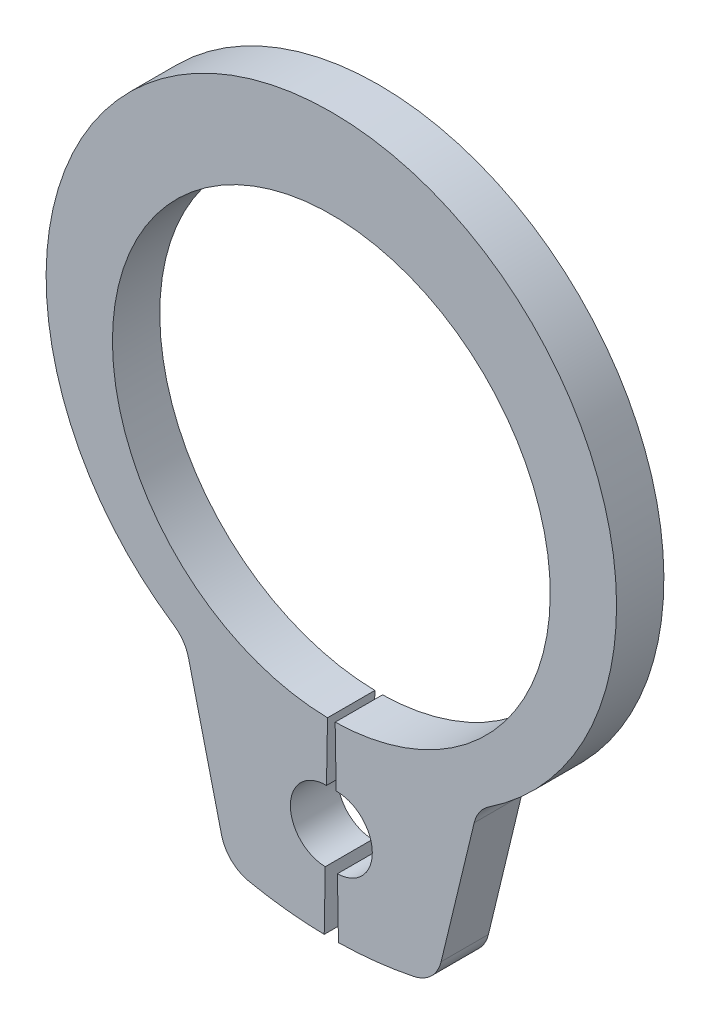
ISO-10303-21;
HEADER;
FILE_DESCRIPTION(('STEP AP214'),'2;1');
FILE_NAME('part.step','',(''),(''),'','','');
FILE_SCHEMA(('AUTOMOTIVE_DESIGN { 1 0 10303 214 1 1 1 1 }'));
ENDSEC;
DATA;
#1=APPLICATION_CONTEXT('core data for automotive mechanical design processes');
#2=APPLICATION_PROTOCOL_DEFINITION('international standard','automotive_design',2000,#1);
#3=PRODUCT_CONTEXT('',#1,'mechanical');
#4=PRODUCT('Part','Part','',(#3));
#5=PRODUCT_RELATED_PRODUCT_CATEGORY('part','',(#4));
#6=PRODUCT_DEFINITION_FORMATION('','',#4);
#7=PRODUCT_DEFINITION_CONTEXT('part definition',#1,'design');
#8=PRODUCT_DEFINITION('design','',#6,#7);
#9=PRODUCT_DEFINITION_SHAPE('','',#8);
#10=(LENGTH_UNIT() NAMED_UNIT(*) SI_UNIT(.MILLI.,.METRE.));
#11=(NAMED_UNIT(*) PLANE_ANGLE_UNIT() SI_UNIT($,.RADIAN.));
#12=(NAMED_UNIT(*) SI_UNIT($,.STERADIAN.) SOLID_ANGLE_UNIT());
#13=UNCERTAINTY_MEASURE_WITH_UNIT(LENGTH_MEASURE(1.E-05),#10,'distance_accuracy_value','');
#14=(GEOMETRIC_REPRESENTATION_CONTEXT(3) GLOBAL_UNCERTAINTY_ASSIGNED_CONTEXT((#13)) GLOBAL_UNIT_ASSIGNED_CONTEXT((#10,
#11,#12)) REPRESENTATION_CONTEXT('',''));
#15=CARTESIAN_POINT('',(0.,0.,0.));
#16=DIRECTION('',(0.,0.,1.));
#17=DIRECTION('',(1.,0.,0.));
#18=AXIS2_PLACEMENT_3D('',#15,#16,#17);
#19=CARTESIAN_POINT('',(0.,0.,0.4));
#20=DIRECTION('',(0.,0.,-1.));
#21=DIRECTION('',(-1.,0.,0.));
#22=AXIS2_PLACEMENT_3D('',#19,#20,#21);
#23=CYLINDRICAL_SURFACE('',#22,6.9);
#24=CARTESIAN_POINT('',(0.,0.,0.4));
#25=DIRECTION('',(0.,0.,1.));
#26=DIRECTION('',(1.,0.,0.));
#27=AXIS2_PLACEMENT_3D('',#24,#25,#26);
#28=CIRCLE('',#27,6.9);
#29=CARTESIAN_POINT('',(-1.39361783575704,-6.75779766846122,0.4));
#30=VERTEX_POINT('',#29);
#31=CARTESIAN_POINT('',(-0.120421604417256,-6.8989490965791,0.4));
#32=VERTEX_POINT('',#31);
#33=EDGE_CURVE('E184',#30,#32,#28,.T.);
#34=ORIENTED_EDGE('',*,*,#33,.F.);
#35=DIRECTION('',(0.,0.,-1.));
#36=VECTOR('',#35,1.);
#37=CARTESIAN_POINT('',(-1.39361783575704,-6.75779766846122,0.4));
#38=LINE('',#37,#36);
#39=CARTESIAN_POINT('',(-1.39361783575704,-6.75779766846122,-0.4));
#40=VERTEX_POINT('',#39);
#41=EDGE_CURVE('E213',#30,#40,#38,.T.);
#42=ORIENTED_EDGE('',*,*,#41,.T.);
#43=CARTESIAN_POINT('',(0.,0.,-0.4));
#44=DIRECTION('',(0.,0.,1.));
#45=DIRECTION('',(1.,0.,0.));
#46=AXIS2_PLACEMENT_3D('',#43,#44,#45);
#47=CIRCLE('',#46,6.9);
#48=CARTESIAN_POINT('',(-0.120421604417256,-6.8989490965791,-0.4));
#49=VERTEX_POINT('',#48);
#50=EDGE_CURVE('E210',#40,#49,#47,.T.);
#51=ORIENTED_EDGE('',*,*,#50,.T.);
#52=DIRECTION('',(0.,0.,-1.));
#53=VECTOR('',#52,1.);
#54=CARTESIAN_POINT('',(-0.120421604417256,-6.8989490965791,0.4));
#55=LINE('',#54,#53);
#56=EDGE_CURVE('E202',#32,#49,#55,.T.);
#57=ORIENTED_EDGE('',*,*,#56,.F.);
#58=EDGE_LOOP('',(#34,#42,#51,#57));
#59=FACE_BOUND('',#58,.T.);
#60=ADVANCED_FACE('F40',(#59),#23,.T.);
#61=CARTESIAN_POINT('',(-0.102969197979972,-5.89910140142271,0.4));
#62=DIRECTION('',(-0.999847695156391,0.0174524064372834,0.));
#63=DIRECTION('',(-0.0174524064372834,-0.999847695156391,0.));
#64=AXIS2_PLACEMENT_3D('',#61,#62,#63);
#65=PLANE('',#64);
#66=DIRECTION('',(0.0174524064372834,0.999847695156391,0.));
#67=VECTOR('',#66,1.);
#68=CARTESIAN_POINT('',(-0.102969197979972,-5.89910140142271,-0.4));
#69=LINE('',#68,#67);
#70=CARTESIAN_POINT('',(-0.102969197979972,-5.89910140142271,-0.4));
#71=VERTEX_POINT('',#70);
#72=EDGE_CURVE('E299',#49,#71,#69,.T.);
#73=ORIENTED_EDGE('',*,*,#72,.T.);
#74=DIRECTION('',(0.,0.,-1.));
#75=VECTOR('',#74,1.);
#76=CARTESIAN_POINT('',(-0.102969197979972,-5.89910140142271,0.4));
#77=LINE('',#76,#75);
#78=CARTESIAN_POINT('',(-0.102969197979972,-5.89910140142271,0.4));
#79=VERTEX_POINT('',#78);
#80=EDGE_CURVE('E204',#79,#71,#77,.T.);
#81=ORIENTED_EDGE('',*,*,#80,.F.);
#82=DIRECTION('',(0.0174524064372834,0.999847695156391,0.));
#83=VECTOR('',#82,1.);
#84=CARTESIAN_POINT('',(-0.102969197979972,-5.89910140142271,0.4));
#85=LINE('',#84,#83);
#86=EDGE_CURVE('E188',#32,#79,#85,.T.);
#87=ORIENTED_EDGE('',*,*,#86,.F.);
#88=ORIENTED_EDGE('',*,*,#56,.T.);
#89=EDGE_LOOP('',(#73,#81,#87,#88));
#90=FACE_BOUND('',#89,.T.);
#91=ADVANCED_FACE('F201',(#90),#65,.F.);
#92=CARTESIAN_POINT('',(-0.0924977541176022,-5.29919278432887,0.4));
#93=DIRECTION('',(0.,0.,-1.));
#94=DIRECTION('',(-1.,0.,0.));
#95=AXIS2_PLACEMENT_3D('',#92,#93,#94);
#96=CYLINDRICAL_SURFACE('',#95,0.6);
#97=CARTESIAN_POINT('',(-0.0924977541176022,-5.29919278432887,-0.4));
#98=DIRECTION('',(0.,0.,-1.));
#99=DIRECTION('',(-1.,0.,0.));
#100=AXIS2_PLACEMENT_3D('',#97,#98,#99);
#101=CIRCLE('',#100,0.6);
#102=CARTESIAN_POINT('',(-0.0820263102552321,-4.69928416723504,-0.4));
#103=VERTEX_POINT('',#102);
#104=EDGE_CURVE('E302',#71,#103,#101,.T.);
#105=ORIENTED_EDGE('',*,*,#104,.T.);
#106=DIRECTION('',(0.,0.,-1.));
#107=VECTOR('',#106,1.);
#108=CARTESIAN_POINT('',(-0.0820263102552321,-4.69928416723504,0.4));
#109=LINE('',#108,#107);
#110=CARTESIAN_POINT('',(-0.0820263102552321,-4.69928416723504,0.4));
#111=VERTEX_POINT('',#110);
#112=EDGE_CURVE('E221',#111,#103,#109,.T.);
#113=ORIENTED_EDGE('',*,*,#112,.F.);
#114=CARTESIAN_POINT('',(-0.0924977541176022,-5.29919278432887,0.4));
#115=DIRECTION('',(0.,0.,-1.));
#116=DIRECTION('',(-1.,0.,0.));
#117=AXIS2_PLACEMENT_3D('',#114,#115,#116);
#118=CIRCLE('',#117,0.6);
#119=EDGE_CURVE('E207',#79,#111,#118,.T.);
#120=ORIENTED_EDGE('',*,*,#119,.F.);
#121=ORIENTED_EDGE('',*,*,#80,.T.);
#122=EDGE_LOOP('',(#105,#113,#120,#121));
#123=FACE_BOUND('',#122,.T.);
#124=ADVANCED_FACE('F412',(#123),#96,.F.);
#125=CARTESIAN_POINT('',(-0.0645739038179487,-3.69943647207865,0.4));
#126=DIRECTION('',(-0.999847695156391,0.0174524064372834,0.));
#127=DIRECTION('',(-0.0174524064372834,-0.999847695156391,0.));
#128=AXIS2_PLACEMENT_3D('',#125,#126,#127);
#129=PLANE('',#128);
#130=DIRECTION('',(0.0174524064372834,0.999847695156391,0.));
#131=VECTOR('',#130,1.);
#132=CARTESIAN_POINT('',(-0.0645739038179487,-3.69943647207865,-0.4));
#133=LINE('',#132,#131);
#134=CARTESIAN_POINT('',(-0.0645739038179522,-3.69943647207865,-0.4));
#135=VERTEX_POINT('',#134);
#136=EDGE_CURVE('E305',#103,#135,#133,.T.);
#137=ORIENTED_EDGE('',*,*,#136,.T.);
#138=DIRECTION('',(0.,0.,-1.));
#139=VECTOR('',#138,1.);
#140=CARTESIAN_POINT('',(-0.0645739038179522,-3.69943647207865,0.4));
#141=LINE('',#140,#139);
#142=CARTESIAN_POINT('',(-0.0645739038179522,-3.69943647207865,0.4));
#143=VERTEX_POINT('',#142);
#144=EDGE_CURVE('E342',#143,#135,#141,.T.);
#145=ORIENTED_EDGE('',*,*,#144,.F.);
#146=DIRECTION('',(0.0174524064372834,0.999847695156391,0.));
#147=VECTOR('',#146,1.);
#148=CARTESIAN_POINT('',(-0.0645739038179487,-3.69943647207865,0.4));
#149=LINE('',#148,#147);
#150=EDGE_CURVE('E353',#111,#143,#149,.T.);
#151=ORIENTED_EDGE('',*,*,#150,.F.);
#152=ORIENTED_EDGE('',*,*,#112,.T.);
#153=EDGE_LOOP('',(#137,#145,#151,#152));
#154=FACE_BOUND('',#153,.T.);
#155=ADVANCED_FACE('F351',(#154),#129,.F.);
#156=CARTESIAN_POINT('',(0.,0.,0.4));
#157=DIRECTION('',(0.,0.,-1.));
#158=DIRECTION('',(-1.,0.,0.));
#159=AXIS2_PLACEMENT_3D('',#156,#157,#158);
#160=CYLINDRICAL_SURFACE('',#159,3.7);
#161=CARTESIAN_POINT('',(0.,0.,-0.4));
#162=DIRECTION('',(0.,0.,-1.));
#163=DIRECTION('',(1.,0.,0.));
#164=AXIS2_PLACEMENT_3D('',#161,#162,#163);
#165=CIRCLE('',#164,3.7);
#166=CARTESIAN_POINT('',(0.0645739038179487,-3.69943647207865,-0.4));
#167=VERTEX_POINT('',#166);
#168=EDGE_CURVE('E308',#135,#167,#165,.T.);
#169=ORIENTED_EDGE('',*,*,#168,.T.);
#170=DIRECTION('',(0.,0.,-1.));
#171=VECTOR('',#170,1.);
#172=CARTESIAN_POINT('',(0.0645739038179487,-3.69943647207865,0.4));
#173=LINE('',#172,#171);
#174=CARTESIAN_POINT('',(0.0645739038179487,-3.69943647207865,0.4));
#175=VERTEX_POINT('',#174);
#176=EDGE_CURVE('E338',#175,#167,#173,.T.);
#177=ORIENTED_EDGE('',*,*,#176,.F.);
#178=CARTESIAN_POINT('',(0.,0.,0.4));
#179=DIRECTION('',(0.,0.,-1.));
#180=DIRECTION('',(1.,0.,0.));
#181=AXIS2_PLACEMENT_3D('',#178,#179,#180);
#182=CIRCLE('',#181,3.7);
#183=EDGE_CURVE('E371',#143,#175,#182,.T.);
#184=ORIENTED_EDGE('',*,*,#183,.F.);
#185=ORIENTED_EDGE('',*,*,#144,.T.);
#186=EDGE_LOOP('',(#169,#177,#184,#185));
#187=FACE_BOUND('',#186,.T.);
#188=ADVANCED_FACE('F361',(#187),#160,.F.);
#189=CARTESIAN_POINT('',(0.0645739038179487,-3.69943647207865,0.4));
#190=DIRECTION('',(0.999847695156391,0.0174524064372837,0.));
#191=DIRECTION('',(-0.0174524064372837,0.999847695156391,0.));
#192=AXIS2_PLACEMENT_3D('',#189,#190,#191);
#193=PLANE('',#192);
#194=DIRECTION('',(0.0174524064372837,-0.999847695156391,0.));
#195=VECTOR('',#194,1.);
#196=CARTESIAN_POINT('',(0.0645739038179487,-3.69943647207865,-0.4));
#197=LINE('',#196,#195);
#198=CARTESIAN_POINT('',(0.0820263102552321,-4.69928416723504,-0.4));
#199=VERTEX_POINT('',#198);
#200=EDGE_CURVE('E311',#167,#199,#197,.T.);
#201=ORIENTED_EDGE('',*,*,#200,.T.);
#202=DIRECTION('',(0.,0.,-1.));
#203=VECTOR('',#202,1.);
#204=CARTESIAN_POINT('',(0.0820263102552321,-4.69928416723504,0.4));
#205=LINE('',#204,#203);
#206=CARTESIAN_POINT('',(0.0820263102552321,-4.69928416723504,0.4));
#207=VERTEX_POINT('',#206);
#208=EDGE_CURVE('E334',#207,#199,#205,.T.);
#209=ORIENTED_EDGE('',*,*,#208,.F.);
#210=DIRECTION('',(0.0174524064372837,-0.999847695156391,0.));
#211=VECTOR('',#210,1.);
#212=CARTESIAN_POINT('',(0.0645739038179487,-3.69943647207865,0.4));
#213=LINE('',#212,#211);
#214=EDGE_CURVE('E367',#175,#207,#213,.T.);
#215=ORIENTED_EDGE('',*,*,#214,.F.);
#216=ORIENTED_EDGE('',*,*,#176,.T.);
#217=EDGE_LOOP('',(#201,#209,#215,#216));
#218=FACE_BOUND('',#217,.T.);
#219=ADVANCED_FACE('F365',(#218),#193,.F.);
#220=CARTESIAN_POINT('',(0.0924977541176026,-5.29919278432887,0.4));
#221=DIRECTION('',(0.,0.,-1.));
#222=DIRECTION('',(-1.,0.,0.));
#223=AXIS2_PLACEMENT_3D('',#220,#221,#222);
#224=CYLINDRICAL_SURFACE('',#223,0.6);
#225=CARTESIAN_POINT('',(0.0924977541176026,-5.29919278432887,-0.4));
#226=DIRECTION('',(0.,0.,-1.));
#227=DIRECTION('',(1.,0.,0.));
#228=AXIS2_PLACEMENT_3D('',#225,#226,#227);
#229=CIRCLE('',#228,0.6);
#230=CARTESIAN_POINT('',(0.102969197979973,-5.89910140142271,-0.4));
#231=VERTEX_POINT('',#230);
#232=EDGE_CURVE('E314',#199,#231,#229,.T.);
#233=ORIENTED_EDGE('',*,*,#232,.T.);
#234=DIRECTION('',(0.,0.,-1.));
#235=VECTOR('',#234,1.);
#236=CARTESIAN_POINT('',(0.102969197979973,-5.89910140142271,0.4));
#237=LINE('',#236,#235);
#238=CARTESIAN_POINT('',(0.102969197979973,-5.89910140142271,0.4));
#239=VERTEX_POINT('',#238);
#240=EDGE_CURVE('E330',#239,#231,#237,.T.);
#241=ORIENTED_EDGE('',*,*,#240,.F.);
#242=CARTESIAN_POINT('',(0.0924977541176026,-5.29919278432887,0.4));
#243=DIRECTION('',(0.,0.,-1.));
#244=DIRECTION('',(1.,0.,0.));
#245=AXIS2_PLACEMENT_3D('',#242,#243,#244);
#246=CIRCLE('',#245,0.6);
#247=EDGE_CURVE('E370',#207,#239,#246,.T.);
#248=ORIENTED_EDGE('',*,*,#247,.F.);
#249=ORIENTED_EDGE('',*,*,#208,.T.);
#250=EDGE_LOOP('',(#233,#241,#248,#249));
#251=FACE_BOUND('',#250,.T.);
#252=ADVANCED_FACE('F398',(#251),#224,.F.);
#253=CARTESIAN_POINT('',(0.102969197979973,-5.89910140142271,0.4));
#254=DIRECTION('',(0.999847695156391,0.0174524064372837,0.));
#255=DIRECTION('',(-0.0174524064372837,0.999847695156391,0.));
#256=AXIS2_PLACEMENT_3D('',#253,#254,#255);
#257=PLANE('',#256);
#258=DIRECTION('',(0.0174524064372837,-0.999847695156391,0.));
#259=VECTOR('',#258,1.);
#260=CARTESIAN_POINT('',(0.102969197979973,-5.89910140142271,-0.4));
#261=LINE('',#260,#259);
#262=CARTESIAN_POINT('',(0.120421604417254,-6.8989490965791,-0.4));
#263=VERTEX_POINT('',#262);
#264=EDGE_CURVE('E317',#231,#263,#261,.T.);
#265=ORIENTED_EDGE('',*,*,#264,.T.);
#266=DIRECTION('',(0.,0.,-1.));
#267=VECTOR('',#266,1.);
#268=CARTESIAN_POINT('',(0.120421604417254,-6.8989490965791,0.4));
#269=LINE('',#268,#267);
#270=CARTESIAN_POINT('',(0.120421604417254,-6.8989490965791,0.4));
#271=VERTEX_POINT('',#270);
#272=EDGE_CURVE('E291',#271,#263,#269,.T.);
#273=ORIENTED_EDGE('',*,*,#272,.F.);
#274=DIRECTION('',(0.0174524064372837,-0.999847695156391,0.));
#275=VECTOR('',#274,1.);
#276=CARTESIAN_POINT('',(0.102969197979973,-5.89910140142271,0.4));
#277=LINE('',#276,#275);
#278=EDGE_CURVE('E374',#239,#271,#277,.T.);
#279=ORIENTED_EDGE('',*,*,#278,.F.);
#280=ORIENTED_EDGE('',*,*,#240,.T.);
#281=EDGE_LOOP('',(#265,#273,#279,#280));
#282=FACE_BOUND('',#281,.T.);
#283=ADVANCED_FACE('F395',(#282),#257,.F.);
#284=CARTESIAN_POINT('',(0.,0.,0.4));
#285=DIRECTION('',(0.,0.,-1.));
#286=DIRECTION('',(-1.,0.,0.));
#287=AXIS2_PLACEMENT_3D('',#284,#285,#286);
#288=CYLINDRICAL_SURFACE('',#287,6.9);
#289=CARTESIAN_POINT('',(0.,0.,-0.4));
#290=DIRECTION('',(0.,0.,1.));
#291=DIRECTION('',(1.,0.,0.));
#292=AXIS2_PLACEMENT_3D('',#289,#290,#291);
#293=CIRCLE('',#292,6.9);
#294=CARTESIAN_POINT('',(1.39361783575704,-6.75779766846122,-0.4));
#295=VERTEX_POINT('',#294);
#296=EDGE_CURVE('E280',#263,#295,#293,.T.);
#297=ORIENTED_EDGE('',*,*,#296,.T.);
#298=DIRECTION('',(0.,0.,-1.));
#299=VECTOR('',#298,1.);
#300=CARTESIAN_POINT('',(1.39361783575704,-6.75779766846122,0.4));
#301=LINE('',#300,#299);
#302=CARTESIAN_POINT('',(1.39361783575704,-6.75779766846122,0.4));
#303=VERTEX_POINT('',#302);
#304=EDGE_CURVE('E255',#295,#303,#301,.F.);
#305=ORIENTED_EDGE('',*,*,#304,.T.);
#306=CARTESIAN_POINT('',(0.,0.,0.4));
#307=DIRECTION('',(0.,0.,1.));
#308=DIRECTION('',(1.,0.,0.));
#309=AXIS2_PLACEMENT_3D('',#306,#307,#308);
#310=CIRCLE('',#309,6.9);
#311=EDGE_CURVE('E294',#271,#303,#310,.T.);
#312=ORIENTED_EDGE('',*,*,#311,.F.);
#313=ORIENTED_EDGE('',*,*,#272,.T.);
#314=EDGE_LOOP('',(#297,#305,#312,#313));
#315=FACE_BOUND('',#314,.T.);
#316=ADVANCED_FACE('F393',(#315),#288,.T.);
#317=CARTESIAN_POINT('',(2.47164510435583,-3.7604481751666,0.4));
#318=DIRECTION('',(-0.972054005477297,0.234757343730805,0.));
#319=DIRECTION('',(-0.234757343730805,-0.972054005477297,0.));
#320=AXIS2_PLACEMENT_3D('',#317,#318,#319);
#321=PLANE('',#320);
#322=DIRECTION('',(0.234757343730805,0.972054005477297,0.));
#323=VECTOR('',#322,1.);
#324=CARTESIAN_POINT('',(2.47164510435583,-3.7604481751666,0.4));
#325=LINE('',#324,#323);
#326=CARTESIAN_POINT('',(1.85566607941237,-6.31101749483351,0.4));
#327=VERTEX_POINT('',#326);
#328=CARTESIAN_POINT('',(2.41448415023319,-3.99713314326513,0.4));
#329=VERTEX_POINT('',#328);
#330=EDGE_CURVE('E287',#327,#329,#325,.T.);
#331=ORIENTED_EDGE('',*,*,#330,.F.);
#332=DIRECTION('',(0.,0.,-1.));
#333=VECTOR('',#332,1.);
#334=CARTESIAN_POINT('',(1.85566607941237,-6.31101749483351,0.4));
#335=LINE('',#334,#333);
#336=CARTESIAN_POINT('',(1.85566607941237,-6.31101749483351,-0.4));
#337=VERTEX_POINT('',#336);
#338=EDGE_CURVE('E251',#327,#337,#335,.T.);
#339=ORIENTED_EDGE('',*,*,#338,.T.);
#340=DIRECTION('',(0.234757343730805,0.972054005477297,0.));
#341=VECTOR('',#340,1.);
#342=CARTESIAN_POINT('',(2.47164510435583,-3.7604481751666,-0.4));
#343=LINE('',#342,#341);
#344=CARTESIAN_POINT('',(2.41448415023319,-3.99713314326513,-0.4));
#345=VERTEX_POINT('',#344);
#346=EDGE_CURVE('E270',#337,#345,#343,.T.);
#347=ORIENTED_EDGE('',*,*,#346,.T.);
#348=DIRECTION('',(0.,0.,1.));
#349=VECTOR('',#348,1.);
#350=CARTESIAN_POINT('',(2.41448415023319,-3.99713314326513,0.4));
#351=LINE('',#350,#349);
#352=EDGE_CURVE('E248',#345,#329,#351,.T.);
#353=ORIENTED_EDGE('',*,*,#352,.T.);
#354=EDGE_LOOP('',(#331,#339,#347,#353));
#355=FACE_BOUND('',#354,.T.);
#356=ADVANCED_FACE('F277',(#355),#321,.F.);
#357=CARTESIAN_POINT('',(0.,0.378887298227901,0.4));
#358=DIRECTION('',(0.,0.,-1.));
#359=DIRECTION('',(-1.,0.,0.));
#360=AXIS2_PLACEMENT_3D('',#357,#358,#359);
#361=CYLINDRICAL_SURFACE('',#360,4.8211127017721);
#362=CARTESIAN_POINT('',(0.,0.378887298227901,-0.4));
#363=DIRECTION('',(0.,0.,1.));
#364=DIRECTION('',(1.,0.,0.));
#365=AXIS2_PLACEMENT_3D('',#362,#363,#364);
#366=CIRCLE('',#365,4.8211127017721);
#367=CARTESIAN_POINT('',(2.66593412598882,-3.63806713505567,-0.4));
#368=VERTEX_POINT('',#367);
#369=CARTESIAN_POINT('',(-2.66593412598882,-3.63806713505567,-0.4));
#370=VERTEX_POINT('',#369);
#371=EDGE_CURVE('E271',#368,#370,#366,.T.);
#372=ORIENTED_EDGE('',*,*,#371,.T.);
#373=DIRECTION('',(0.,0.,-1.));
#374=VECTOR('',#373,1.);
#375=CARTESIAN_POINT('',(-2.66593412598882,-3.63806713505567,0.4));
#376=LINE('',#375,#374);
#377=CARTESIAN_POINT('',(-2.66593412598882,-3.63806713505567,0.4));
#378=VERTEX_POINT('',#377);
#379=EDGE_CURVE('E59',#370,#378,#376,.F.);
#380=ORIENTED_EDGE('',*,*,#379,.T.);
#381=CARTESIAN_POINT('',(0.,0.378887298227901,0.4));
#382=DIRECTION('',(0.,0.,1.));
#383=DIRECTION('',(1.,0.,0.));
#384=AXIS2_PLACEMENT_3D('',#381,#382,#383);
#385=CIRCLE('',#384,4.8211127017721);
#386=CARTESIAN_POINT('',(2.66593412598882,-3.63806713505567,0.4));
#387=VERTEX_POINT('',#386);
#388=EDGE_CURVE('E283',#387,#378,#385,.T.);
#389=ORIENTED_EDGE('',*,*,#388,.F.);
#390=DIRECTION('',(0.,0.,-1.));
#391=VECTOR('',#390,1.);
#392=CARTESIAN_POINT('',(2.66593412598882,-3.63806713505567,0.4));
#393=LINE('',#392,#391);
#394=EDGE_CURVE('E242',#387,#368,#393,.T.);
#395=ORIENTED_EDGE('',*,*,#394,.T.);
#396=EDGE_LOOP('',(#372,#380,#389,#395));
#397=FACE_BOUND('',#396,.T.);
#398=ADVANCED_FACE('F282',(#397),#361,.T.);
#399=CARTESIAN_POINT('',(-2.47164510435583,-3.7604481751666,0.4));
#400=DIRECTION('',(0.972054005477297,0.234757343730806,0.));
#401=DIRECTION('',(-0.234757343730806,0.972054005477297,0.));
#402=AXIS2_PLACEMENT_3D('',#399,#400,#401);
#403=PLANE('',#402);
#404=DIRECTION('',(0.234757343730806,-0.972054005477297,0.));
#405=VECTOR('',#404,1.);
#406=CARTESIAN_POINT('',(-2.47164510435583,-3.7604481751666,-0.4));
#407=LINE('',#406,#405);
#408=CARTESIAN_POINT('',(-2.41448415023319,-3.99713314326512,-0.4));
#409=VERTEX_POINT('',#408);
#410=CARTESIAN_POINT('',(-1.85566607941237,-6.31101749483351,-0.4));
#411=VERTEX_POINT('',#410);
#412=EDGE_CURVE('E197',#409,#411,#407,.T.);
#413=ORIENTED_EDGE('',*,*,#412,.T.);
#414=DIRECTION('',(0.,0.,-1.));
#415=VECTOR('',#414,1.);
#416=CARTESIAN_POINT('',(-1.85566607941237,-6.31101749483351,0.4));
#417=LINE('',#416,#415);
#418=CARTESIAN_POINT('',(-1.85566607941237,-6.31101749483351,0.4));
#419=VERTEX_POINT('',#418);
#420=EDGE_CURVE('E234',#411,#419,#417,.F.);
#421=ORIENTED_EDGE('',*,*,#420,.T.);
#422=DIRECTION('',(0.234757343730806,-0.972054005477297,0.));
#423=VECTOR('',#422,1.);
#424=CARTESIAN_POINT('',(-2.47164510435583,-3.7604481751666,0.4));
#425=LINE('',#424,#423);
#426=CARTESIAN_POINT('',(-2.41448415023319,-3.99713314326512,0.4));
#427=VERTEX_POINT('',#426);
#428=EDGE_CURVE('E286',#427,#419,#425,.T.);
#429=ORIENTED_EDGE('',*,*,#428,.F.);
#430=DIRECTION('',(0.,0.,1.));
#431=VECTOR('',#430,1.);
#432=CARTESIAN_POINT('',(-2.41448415023319,-3.99713314326512,-0.4));
#433=LINE('',#432,#431);
#434=EDGE_CURVE('E230',#427,#409,#433,.F.);
#435=ORIENTED_EDGE('',*,*,#434,.T.);
#436=EDGE_LOOP('',(#413,#421,#429,#435));
#437=FACE_BOUND('',#436,.T.);
#438=ADVANCED_FACE('F468',(#437),#403,.F.);
#439=CARTESIAN_POINT('',(0.,0.,0.4));
#440=DIRECTION('',(0.,0.,1.));
#441=DIRECTION('',(1.,0.,0.));
#442=AXIS2_PLACEMENT_3D('',#439,#440,#441);
#443=PLANE('',#442);
#444=ORIENTED_EDGE('',*,*,#428,.T.);
#445=CARTESIAN_POINT('',(-1.272433676126,-6.17016308859503,0.4));
#446=DIRECTION('',(0.,0.,1.));
#447=DIRECTION('',(1.,0.,0.));
#448=AXIS2_PLACEMENT_3D('',#445,#446,#447);
#449=CIRCLE('',#448,0.6);
#450=EDGE_CURVE('E191',#419,#30,#449,.T.);
#451=ORIENTED_EDGE('',*,*,#450,.T.);
#452=ORIENTED_EDGE('',*,*,#33,.T.);
#453=ORIENTED_EDGE('',*,*,#86,.T.);
#454=ORIENTED_EDGE('',*,*,#119,.T.);
#455=ORIENTED_EDGE('',*,*,#150,.T.);
#456=ORIENTED_EDGE('',*,*,#183,.T.);
#457=ORIENTED_EDGE('',*,*,#214,.T.);
#458=ORIENTED_EDGE('',*,*,#247,.T.);
#459=ORIENTED_EDGE('',*,*,#278,.T.);
#460=ORIENTED_EDGE('',*,*,#311,.T.);
#461=CARTESIAN_POINT('',(1.272433676126,-6.17016308859503,0.4));
#462=DIRECTION('',(0.,0.,1.));
#463=DIRECTION('',(1.,0.,0.));
#464=AXIS2_PLACEMENT_3D('',#461,#462,#463);
#465=CIRCLE('',#464,0.6);
#466=EDGE_CURVE('E237',#303,#327,#465,.T.);
#467=ORIENTED_EDGE('',*,*,#466,.T.);
#468=ORIENTED_EDGE('',*,*,#330,.T.);
#469=CARTESIAN_POINT('',(2.99771655351957,-4.13798754950361,0.4));
#470=DIRECTION('',(0.,0.,1.));
#471=DIRECTION('',(1.,0.,0.));
#472=AXIS2_PLACEMENT_3D('',#469,#470,#471);
#473=CIRCLE('',#472,0.6);
#474=EDGE_CURVE('E11',#329,#387,#473,.F.);
#475=ORIENTED_EDGE('',*,*,#474,.T.);
#476=ORIENTED_EDGE('',*,*,#388,.T.);
#477=CARTESIAN_POINT('',(-2.99771655351957,-4.13798754950361,0.4));
#478=DIRECTION('',(0.,0.,1.));
#479=DIRECTION('',(1.,0.,0.));
#480=AXIS2_PLACEMENT_3D('',#477,#478,#479);
#481=CIRCLE('',#480,0.6);
#482=EDGE_CURVE('E261',#378,#427,#481,.F.);
#483=ORIENTED_EDGE('',*,*,#482,.T.);
#484=EDGE_LOOP('',(#444,#451,#452,#453,#454,#455,#456,#457,#458,#459,#460,#467,#468,#475,#476,#483));
#485=FACE_BOUND('',#484,.T.);
#486=ADVANCED_FACE('F187',(#485),#443,.T.);
#487=CARTESIAN_POINT('',(0.,0.,-0.4));
#488=DIRECTION('',(0.,0.,1.));
#489=DIRECTION('',(1.,0.,0.));
#490=AXIS2_PLACEMENT_3D('',#487,#488,#489);
#491=PLANE('',#490);
#492=ORIENTED_EDGE('',*,*,#50,.F.);
#493=CARTESIAN_POINT('',(-1.272433676126,-6.17016308859503,-0.4));
#494=DIRECTION('',(0.,0.,1.));
#495=DIRECTION('',(1.,0.,0.));
#496=AXIS2_PLACEMENT_3D('',#493,#494,#495);
#497=CIRCLE('',#496,0.6);
#498=EDGE_CURVE('E227',#40,#411,#497,.F.);
#499=ORIENTED_EDGE('',*,*,#498,.T.);
#500=ORIENTED_EDGE('',*,*,#412,.F.);
#501=CARTESIAN_POINT('',(-2.99771655351957,-4.13798754950361,-0.4));
#502=DIRECTION('',(0.,0.,1.));
#503=DIRECTION('',(1.,0.,0.));
#504=AXIS2_PLACEMENT_3D('',#501,#502,#503);
#505=CIRCLE('',#504,0.6);
#506=EDGE_CURVE('E258',#409,#370,#505,.T.);
#507=ORIENTED_EDGE('',*,*,#506,.T.);
#508=ORIENTED_EDGE('',*,*,#371,.F.);
#509=CARTESIAN_POINT('',(2.99771655351957,-4.13798754950361,-0.4));
#510=DIRECTION('',(0.,0.,1.));
#511=DIRECTION('',(1.,0.,0.));
#512=AXIS2_PLACEMENT_3D('',#509,#510,#511);
#513=CIRCLE('',#512,0.6);
#514=EDGE_CURVE('E49',#368,#345,#513,.T.);
#515=ORIENTED_EDGE('',*,*,#514,.T.);
#516=ORIENTED_EDGE('',*,*,#346,.F.);
#517=CARTESIAN_POINT('',(1.272433676126,-6.17016308859503,-0.4));
#518=DIRECTION('',(0.,0.,1.));
#519=DIRECTION('',(1.,0.,0.));
#520=AXIS2_PLACEMENT_3D('',#517,#518,#519);
#521=CIRCLE('',#520,0.6);
#522=EDGE_CURVE('E218',#337,#295,#521,.F.);
#523=ORIENTED_EDGE('',*,*,#522,.T.);
#524=ORIENTED_EDGE('',*,*,#296,.F.);
#525=ORIENTED_EDGE('',*,*,#264,.F.);
#526=ORIENTED_EDGE('',*,*,#232,.F.);
#527=ORIENTED_EDGE('',*,*,#200,.F.);
#528=ORIENTED_EDGE('',*,*,#168,.F.);
#529=ORIENTED_EDGE('',*,*,#136,.F.);
#530=ORIENTED_EDGE('',*,*,#104,.F.);
#531=ORIENTED_EDGE('',*,*,#72,.F.);
#532=EDGE_LOOP('',(#492,#499,#500,#507,#508,#515,#516,#523,#524,#525,#526,#527,#528,#529,#530,#531));
#533=FACE_BOUND('',#532,.T.);
#534=ADVANCED_FACE('F269',(#533),#491,.F.);
#535=CARTESIAN_POINT('',(-1.272433676126,-6.17016308859503,0.4));
#536=DIRECTION('',(0.,0.,-1.));
#537=DIRECTION('',(-1.,0.,0.));
#538=AXIS2_PLACEMENT_3D('',#535,#536,#537);
#539=CYLINDRICAL_SURFACE('',#538,0.6);
#540=ORIENTED_EDGE('',*,*,#450,.F.);
#541=ORIENTED_EDGE('',*,*,#420,.F.);
#542=ORIENTED_EDGE('',*,*,#498,.F.);
#543=ORIENTED_EDGE('',*,*,#41,.F.);
#544=EDGE_LOOP('',(#540,#541,#542,#543));
#545=FACE_BOUND('',#544,.T.);
#546=ADVANCED_FACE('F416',(#545),#539,.T.);
#547=CARTESIAN_POINT('',(-2.99771655351957,-4.13798754950361,0.4));
#548=DIRECTION('',(0.,0.,-1.));
#549=DIRECTION('',(-1.,0.,0.));
#550=AXIS2_PLACEMENT_3D('',#547,#548,#549);
#551=CYLINDRICAL_SURFACE('',#550,0.6);
#552=ORIENTED_EDGE('',*,*,#482,.F.);
#553=ORIENTED_EDGE('',*,*,#379,.F.);
#554=ORIENTED_EDGE('',*,*,#506,.F.);
#555=ORIENTED_EDGE('',*,*,#434,.F.);
#556=EDGE_LOOP('',(#552,#553,#554,#555));
#557=FACE_BOUND('',#556,.T.);
#558=ADVANCED_FACE('F419',(#557),#551,.F.);
#559=CARTESIAN_POINT('',(1.272433676126,-6.17016308859503,0.4));
#560=DIRECTION('',(0.,0.,-1.));
#561=DIRECTION('',(-1.,0.,0.));
#562=AXIS2_PLACEMENT_3D('',#559,#560,#561);
#563=CYLINDRICAL_SURFACE('',#562,0.6);
#564=ORIENTED_EDGE('',*,*,#466,.F.);
#565=ORIENTED_EDGE('',*,*,#304,.F.);
#566=ORIENTED_EDGE('',*,*,#522,.F.);
#567=ORIENTED_EDGE('',*,*,#338,.F.);
#568=EDGE_LOOP('',(#564,#565,#566,#567));
#569=FACE_BOUND('',#568,.T.);
#570=ADVANCED_FACE('F390',(#569),#563,.T.);
#571=CARTESIAN_POINT('',(2.99771655351957,-4.13798754950361,0.4));
#572=DIRECTION('',(0.,0.,-1.));
#573=DIRECTION('',(-1.,0.,0.));
#574=AXIS2_PLACEMENT_3D('',#571,#572,#573);
#575=CYLINDRICAL_SURFACE('',#574,0.6);
#576=ORIENTED_EDGE('',*,*,#474,.F.);
#577=ORIENTED_EDGE('',*,*,#352,.F.);
#578=ORIENTED_EDGE('',*,*,#514,.F.);
#579=ORIENTED_EDGE('',*,*,#394,.F.);
#580=EDGE_LOOP('',(#576,#577,#578,#579));
#581=FACE_BOUND('',#580,.T.);
#582=ADVANCED_FACE('F42',(#581),#575,.F.);
#583=CLOSED_SHELL('',(#60,#91,#124,#155,#188,#219,#252,#283,#316,#356,#398,#438,#486,#534,#546,
#558,#570,#582));
#584=MANIFOLD_SOLID_BREP('B2',#583);
#585=ADVANCED_BREP_SHAPE_REPRESENTATION('',(#18,#584),#14);
#586=SHAPE_DEFINITION_REPRESENTATION(#9,#585);
ENDSEC;
END-ISO-10303-21;
